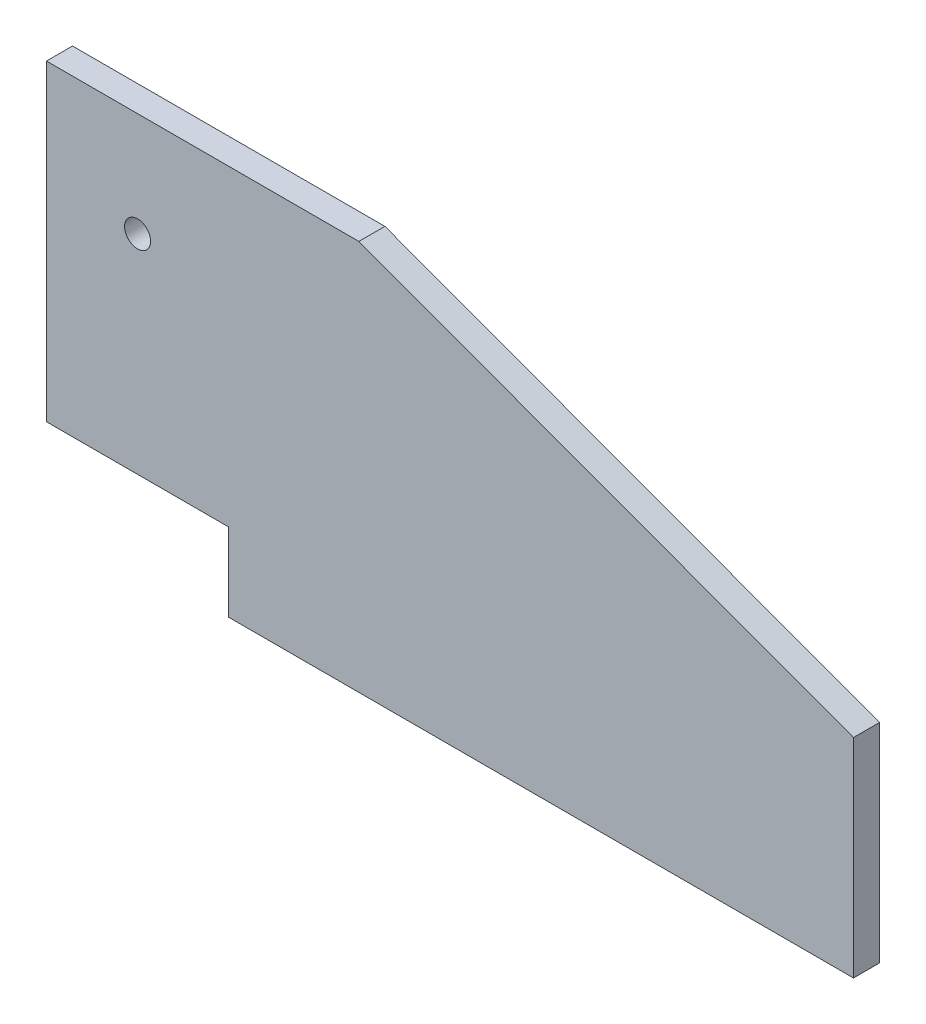
ISO-10303-21;
HEADER;
FILE_DESCRIPTION(('STEP AP214'),'2;1');
FILE_NAME('part.step','',(''),(''),'','','');
FILE_SCHEMA(('AUTOMOTIVE_DESIGN { 1 0 10303 214 1 1 1 1 }'));
ENDSEC;
DATA;
#1=APPLICATION_CONTEXT('core data for automotive mechanical design processes');
#2=APPLICATION_PROTOCOL_DEFINITION('international standard','automotive_design',2000,#1);
#3=PRODUCT_CONTEXT('',#1,'mechanical');
#4=PRODUCT('Part','Part','',(#3));
#5=PRODUCT_RELATED_PRODUCT_CATEGORY('part','',(#4));
#6=PRODUCT_DEFINITION_FORMATION('','',#4);
#7=PRODUCT_DEFINITION_CONTEXT('part definition',#1,'design');
#8=PRODUCT_DEFINITION('design','',#6,#7);
#9=PRODUCT_DEFINITION_SHAPE('','',#8);
#10=(LENGTH_UNIT() NAMED_UNIT(*) SI_UNIT(.MILLI.,.METRE.));
#11=(NAMED_UNIT(*) PLANE_ANGLE_UNIT() SI_UNIT($,.RADIAN.));
#12=(NAMED_UNIT(*) SI_UNIT($,.STERADIAN.) SOLID_ANGLE_UNIT());
#13=UNCERTAINTY_MEASURE_WITH_UNIT(LENGTH_MEASURE(1.E-05),#10,'distance_accuracy_value','');
#14=(GEOMETRIC_REPRESENTATION_CONTEXT(3) GLOBAL_UNCERTAINTY_ASSIGNED_CONTEXT((#13)) GLOBAL_UNIT_ASSIGNED_CONTEXT((#10,
#11,#12)) REPRESENTATION_CONTEXT('',''));
#15=CARTESIAN_POINT('',(0.,0.,0.));
#16=DIRECTION('',(0.,0.,1.));
#17=DIRECTION('',(1.,0.,0.));
#18=AXIS2_PLACEMENT_3D('',#15,#16,#17);
#19=CARTESIAN_POINT('',(0.,0.,-6.35));
#20=DIRECTION('',(0.,0.,-1.));
#21=DIRECTION('',(-1.,0.,0.));
#22=AXIS2_PLACEMENT_3D('',#19,#20,#21);
#23=PLANE('',#22);
#24=DIRECTION('',(-1.,0.,0.));
#25=VECTOR('',#24,1.);
#26=CARTESIAN_POINT('',(0.,38.1437968103225,-6.35));
#27=LINE('',#26,#25);
#28=CARTESIAN_POINT('',(0.,38.1437968103225,-6.35));
#29=VERTEX_POINT('',#28);
#30=CARTESIAN_POINT('',(-88.9,38.1437968103225,-6.35));
#31=VERTEX_POINT('',#30);
#32=EDGE_CURVE('E141',#29,#31,#27,.T.);
#33=ORIENTED_EDGE('',*,*,#32,.T.);
#34=DIRECTION('',(0.,1.,0.));
#35=VECTOR('',#34,1.);
#36=CARTESIAN_POINT('',(-88.9,38.1437968103225,-6.35));
#37=LINE('',#36,#35);
#38=CARTESIAN_POINT('',(-88.9,190.543796810323,-6.35));
#39=VERTEX_POINT('',#38);
#40=EDGE_CURVE('E145',#31,#39,#37,.T.);
#41=ORIENTED_EDGE('',*,*,#40,.T.);
#42=DIRECTION('',(1.,0.,0.));
#43=VECTOR('',#42,1.);
#44=CARTESIAN_POINT('',(-88.9,190.543796810323,-6.35));
#45=LINE('',#44,#43);
#46=CARTESIAN_POINT('',(63.4999999999997,190.543796810323,-6.35));
#47=VERTEX_POINT('',#46);
#48=EDGE_CURVE('E150',#39,#47,#45,.T.);
#49=ORIENTED_EDGE('',*,*,#48,.T.);
#50=DIRECTION('',(0.938287860336634,-0.345855303768644,0.));
#51=VECTOR('',#50,1.);
#52=CARTESIAN_POINT('',(63.4999999999997,190.543796810323,-6.35));
#53=LINE('',#52,#51);
#54=CARTESIAN_POINT('',(304.8,101.6,-6.35));
#55=VERTEX_POINT('',#54);
#56=EDGE_CURVE('E154',#47,#55,#53,.T.);
#57=ORIENTED_EDGE('',*,*,#56,.T.);
#58=DIRECTION('',(0.,-1.,0.));
#59=VECTOR('',#58,1.);
#60=CARTESIAN_POINT('',(304.8,101.6,-6.35));
#61=LINE('',#60,#59);
#62=CARTESIAN_POINT('',(304.8,0.,-6.35));
#63=VERTEX_POINT('',#62);
#64=EDGE_CURVE('E158',#55,#63,#61,.T.);
#65=ORIENTED_EDGE('',*,*,#64,.T.);
#66=DIRECTION('',(-1.,0.,0.));
#67=VECTOR('',#66,1.);
#68=CARTESIAN_POINT('',(304.8,0.,-6.35));
#69=LINE('',#68,#67);
#70=CARTESIAN_POINT('',(0.,0.,-6.35));
#71=VERTEX_POINT('',#70);
#72=EDGE_CURVE('E113',#63,#71,#69,.T.);
#73=ORIENTED_EDGE('',*,*,#72,.T.);
#74=DIRECTION('',(0.,1.,0.));
#75=VECTOR('',#74,1.);
#76=CARTESIAN_POINT('',(0.,0.,-6.35));
#77=LINE('',#76,#75);
#78=EDGE_CURVE('E163',#71,#29,#77,.T.);
#79=ORIENTED_EDGE('',*,*,#78,.T.);
#80=EDGE_LOOP('',(#33,#41,#49,#57,#65,#73,#79));
#81=FACE_BOUND('',#80,.T.);
#82=CARTESIAN_POINT('',(-44.45,139.743796810323,-6.35));
#83=DIRECTION('',(0.,0.,1.));
#84=DIRECTION('',(1.,0.,0.));
#85=AXIS2_PLACEMENT_3D('',#82,#83,#84);
#86=CIRCLE('',#85,6.34999999999999);
#87=CARTESIAN_POINT('',(-38.1,139.743796810323,-6.35));
#88=VERTEX_POINT('',#87);
#89=EDGE_CURVE('E146',#88,#88,#86,.T.);
#90=ORIENTED_EDGE('',*,*,#89,.T.);
#91=EDGE_LOOP('',(#90));
#92=FACE_BOUND('',#91,.T.);
#93=ADVANCED_FACE('F43',(#81,#92),#23,.T.);
#94=CARTESIAN_POINT('',(0.,38.1437968103225,6.35));
#95=DIRECTION('',(0.,-1.,0.));
#96=DIRECTION('',(1.,0.,0.));
#97=AXIS2_PLACEMENT_3D('',#94,#95,#96);
#98=PLANE('',#97);
#99=ORIENTED_EDGE('',*,*,#32,.F.);
#100=DIRECTION('',(0.,0.,-1.));
#101=VECTOR('',#100,1.);
#102=CARTESIAN_POINT('',(0.,38.1437968103225,6.35));
#103=LINE('',#102,#101);
#104=CARTESIAN_POINT('',(0.,38.1437968103225,6.35));
#105=VERTEX_POINT('',#104);
#106=EDGE_CURVE('E11',#105,#29,#103,.T.);
#107=ORIENTED_EDGE('',*,*,#106,.F.);
#108=DIRECTION('',(-1.,0.,0.));
#109=VECTOR('',#108,1.);
#110=CARTESIAN_POINT('',(0.,38.1437968103225,6.35));
#111=LINE('',#110,#109);
#112=CARTESIAN_POINT('',(-88.9,38.1437968103225,6.35));
#113=VERTEX_POINT('',#112);
#114=EDGE_CURVE('E166',#105,#113,#111,.T.);
#115=ORIENTED_EDGE('',*,*,#114,.T.);
#116=DIRECTION('',(0.,0.,-1.));
#117=VECTOR('',#116,1.);
#118=CARTESIAN_POINT('',(-88.9,38.1437968103225,6.35));
#119=LINE('',#118,#117);
#120=EDGE_CURVE('E47',#113,#31,#119,.T.);
#121=ORIENTED_EDGE('',*,*,#120,.T.);
#122=EDGE_LOOP('',(#99,#107,#115,#121));
#123=FACE_BOUND('',#122,.T.);
#124=ADVANCED_FACE('F45',(#123),#98,.T.);
#125=CARTESIAN_POINT('',(0.,0.,6.35));
#126=DIRECTION('',(-1.,0.,0.));
#127=DIRECTION('',(0.,0.,1.));
#128=AXIS2_PLACEMENT_3D('',#125,#126,#127);
#129=PLANE('',#128);
#130=ORIENTED_EDGE('',*,*,#78,.F.);
#131=DIRECTION('',(0.,0.,-1.));
#132=VECTOR('',#131,1.);
#133=CARTESIAN_POINT('',(0.,0.,6.35));
#134=LINE('',#133,#132);
#135=CARTESIAN_POINT('',(0.,0.,6.35));
#136=VERTEX_POINT('',#135);
#137=EDGE_CURVE('E54',#136,#71,#134,.T.);
#138=ORIENTED_EDGE('',*,*,#137,.F.);
#139=DIRECTION('',(0.,1.,0.));
#140=VECTOR('',#139,1.);
#141=CARTESIAN_POINT('',(0.,0.,6.35));
#142=LINE('',#141,#140);
#143=EDGE_CURVE('E127',#136,#105,#142,.T.);
#144=ORIENTED_EDGE('',*,*,#143,.T.);
#145=ORIENTED_EDGE('',*,*,#106,.T.);
#146=EDGE_LOOP('',(#130,#138,#144,#145));
#147=FACE_BOUND('',#146,.T.);
#148=ADVANCED_FACE('F181',(#147),#129,.T.);
#149=CARTESIAN_POINT('',(304.8,0.,6.35));
#150=DIRECTION('',(0.,-1.,0.));
#151=DIRECTION('',(1.,0.,0.));
#152=AXIS2_PLACEMENT_3D('',#149,#150,#151);
#153=PLANE('',#152);
#154=ORIENTED_EDGE('',*,*,#72,.F.);
#155=DIRECTION('',(0.,0.,-1.));
#156=VECTOR('',#155,1.);
#157=CARTESIAN_POINT('',(304.8,0.,6.35));
#158=LINE('',#157,#156);
#159=CARTESIAN_POINT('',(304.8,0.,6.35));
#160=VERTEX_POINT('',#159);
#161=EDGE_CURVE('E108',#160,#63,#158,.T.);
#162=ORIENTED_EDGE('',*,*,#161,.F.);
#163=DIRECTION('',(-1.,0.,0.));
#164=VECTOR('',#163,1.);
#165=CARTESIAN_POINT('',(304.8,0.,6.35));
#166=LINE('',#165,#164);
#167=EDGE_CURVE('E111',#160,#136,#166,.T.);
#168=ORIENTED_EDGE('',*,*,#167,.T.);
#169=ORIENTED_EDGE('',*,*,#137,.T.);
#170=EDGE_LOOP('',(#154,#162,#168,#169));
#171=FACE_BOUND('',#170,.T.);
#172=ADVANCED_FACE('F110',(#171),#153,.T.);
#173=CARTESIAN_POINT('',(304.8,101.6,6.35));
#174=DIRECTION('',(1.,0.,0.));
#175=DIRECTION('',(0.,0.,-1.));
#176=AXIS2_PLACEMENT_3D('',#173,#174,#175);
#177=PLANE('',#176);
#178=ORIENTED_EDGE('',*,*,#64,.F.);
#179=DIRECTION('',(0.,0.,-1.));
#180=VECTOR('',#179,1.);
#181=CARTESIAN_POINT('',(304.8,101.6,6.35));
#182=LINE('',#181,#180);
#183=CARTESIAN_POINT('',(304.8,101.6,6.35));
#184=VERTEX_POINT('',#183);
#185=EDGE_CURVE('E119',#184,#55,#182,.T.);
#186=ORIENTED_EDGE('',*,*,#185,.F.);
#187=DIRECTION('',(0.,-1.,0.));
#188=VECTOR('',#187,1.);
#189=CARTESIAN_POINT('',(304.8,101.6,6.35));
#190=LINE('',#189,#188);
#191=EDGE_CURVE('E125',#184,#160,#190,.T.);
#192=ORIENTED_EDGE('',*,*,#191,.T.);
#193=ORIENTED_EDGE('',*,*,#161,.T.);
#194=EDGE_LOOP('',(#178,#186,#192,#193));
#195=FACE_BOUND('',#194,.T.);
#196=ADVANCED_FACE('F130',(#195),#177,.T.);
#197=CARTESIAN_POINT('',(63.4999999999997,190.543796810323,6.35));
#198=DIRECTION('',(0.345855303768644,0.938287860336634,0.));
#199=DIRECTION('',(-0.938287860336634,0.345855303768644,0.));
#200=AXIS2_PLACEMENT_3D('',#197,#198,#199);
#201=PLANE('',#200);
#202=ORIENTED_EDGE('',*,*,#56,.F.);
#203=DIRECTION('',(0.,0.,-1.));
#204=VECTOR('',#203,1.);
#205=CARTESIAN_POINT('',(63.4999999999997,190.543796810323,6.35));
#206=LINE('',#205,#204);
#207=CARTESIAN_POINT('',(63.4999999999997,190.543796810323,6.35));
#208=VERTEX_POINT('',#207);
#209=EDGE_CURVE('E172',#208,#47,#206,.T.);
#210=ORIENTED_EDGE('',*,*,#209,.F.);
#211=DIRECTION('',(0.938287860336634,-0.345855303768644,0.));
#212=VECTOR('',#211,1.);
#213=CARTESIAN_POINT('',(63.4999999999997,190.543796810323,6.35));
#214=LINE('',#213,#212);
#215=EDGE_CURVE('E132',#208,#184,#214,.T.);
#216=ORIENTED_EDGE('',*,*,#215,.T.);
#217=ORIENTED_EDGE('',*,*,#185,.T.);
#218=EDGE_LOOP('',(#202,#210,#216,#217));
#219=FACE_BOUND('',#218,.T.);
#220=ADVANCED_FACE('F224',(#219),#201,.T.);
#221=CARTESIAN_POINT('',(-88.9,190.543796810323,6.35));
#222=DIRECTION('',(0.,1.,0.));
#223=DIRECTION('',(0.,0.,1.));
#224=AXIS2_PLACEMENT_3D('',#221,#222,#223);
#225=PLANE('',#224);
#226=ORIENTED_EDGE('',*,*,#48,.F.);
#227=DIRECTION('',(0.,0.,-1.));
#228=VECTOR('',#227,1.);
#229=CARTESIAN_POINT('',(-88.9,190.543796810323,6.35));
#230=LINE('',#229,#228);
#231=CARTESIAN_POINT('',(-88.9,190.543796810323,6.35));
#232=VERTEX_POINT('',#231);
#233=EDGE_CURVE('E174',#232,#39,#230,.T.);
#234=ORIENTED_EDGE('',*,*,#233,.F.);
#235=DIRECTION('',(1.,0.,0.));
#236=VECTOR('',#235,1.);
#237=CARTESIAN_POINT('',(-88.9,190.543796810323,6.35));
#238=LINE('',#237,#236);
#239=EDGE_CURVE('E135',#232,#208,#238,.T.);
#240=ORIENTED_EDGE('',*,*,#239,.T.);
#241=ORIENTED_EDGE('',*,*,#209,.T.);
#242=EDGE_LOOP('',(#226,#234,#240,#241));
#243=FACE_BOUND('',#242,.T.);
#244=ADVANCED_FACE('F221',(#243),#225,.T.);
#245=CARTESIAN_POINT('',(-88.9,38.1437968103225,6.35));
#246=DIRECTION('',(-1.,0.,0.));
#247=DIRECTION('',(0.,-1.,0.));
#248=AXIS2_PLACEMENT_3D('',#245,#246,#247);
#249=PLANE('',#248);
#250=ORIENTED_EDGE('',*,*,#40,.F.);
#251=ORIENTED_EDGE('',*,*,#120,.F.);
#252=DIRECTION('',(0.,1.,0.));
#253=VECTOR('',#252,1.);
#254=CARTESIAN_POINT('',(-88.9,38.1437968103225,6.35));
#255=LINE('',#254,#253);
#256=EDGE_CURVE('E215',#113,#232,#255,.T.);
#257=ORIENTED_EDGE('',*,*,#256,.T.);
#258=ORIENTED_EDGE('',*,*,#233,.T.);
#259=EDGE_LOOP('',(#250,#251,#257,#258));
#260=FACE_BOUND('',#259,.T.);
#261=ADVANCED_FACE('F178',(#260),#249,.T.);
#262=CARTESIAN_POINT('',(0.,0.,6.35));
#263=DIRECTION('',(0.,0.,-1.));
#264=DIRECTION('',(-1.,0.,0.));
#265=AXIS2_PLACEMENT_3D('',#262,#263,#264);
#266=PLANE('',#265);
#267=CARTESIAN_POINT('',(-44.45,139.743796810323,6.35));
#268=DIRECTION('',(0.,0.,1.));
#269=DIRECTION('',(1.,0.,0.));
#270=AXIS2_PLACEMENT_3D('',#267,#268,#269);
#271=CIRCLE('',#270,6.34999999999999);
#272=CARTESIAN_POINT('',(-38.1,139.743796810323,6.35));
#273=VERTEX_POINT('',#272);
#274=EDGE_CURVE('E207',#273,#273,#271,.T.);
#275=ORIENTED_EDGE('',*,*,#274,.F.);
#276=EDGE_LOOP('',(#275));
#277=FACE_BOUND('',#276,.T.);
#278=ORIENTED_EDGE('',*,*,#114,.F.);
#279=ORIENTED_EDGE('',*,*,#143,.F.);
#280=ORIENTED_EDGE('',*,*,#167,.F.);
#281=ORIENTED_EDGE('',*,*,#191,.F.);
#282=ORIENTED_EDGE('',*,*,#215,.F.);
#283=ORIENTED_EDGE('',*,*,#239,.F.);
#284=ORIENTED_EDGE('',*,*,#256,.F.);
#285=EDGE_LOOP('',(#278,#279,#280,#281,#282,#283,#284));
#286=FACE_BOUND('',#285,.T.);
#287=ADVANCED_FACE('F123',(#277,#286),#266,.F.);
#288=CARTESIAN_POINT('',(-44.45,139.743796810323,6.35));
#289=DIRECTION('',(0.,0.,1.));
#290=DIRECTION('',(1.,0.,0.));
#291=AXIS2_PLACEMENT_3D('',#288,#289,#290);
#292=CYLINDRICAL_SURFACE('',#291,6.34999999999999);
#293=ORIENTED_EDGE('',*,*,#89,.F.);
#294=EDGE_LOOP('',(#293));
#295=FACE_BOUND('',#294,.T.);
#296=ORIENTED_EDGE('',*,*,#274,.T.);
#297=EDGE_LOOP('',(#296));
#298=FACE_BOUND('',#297,.T.);
#299=ADVANCED_FACE('F196',(#295,#298),#292,.F.);
#300=CLOSED_SHELL('',(#93,#124,#148,#172,#196,#220,#244,#261,#287,#299));
#301=MANIFOLD_SOLID_BREP('B2',#300);
#302=ADVANCED_BREP_SHAPE_REPRESENTATION('',(#18,#301),#14);
#303=SHAPE_DEFINITION_REPRESENTATION(#9,#302);
ENDSEC;
END-ISO-10303-21;
